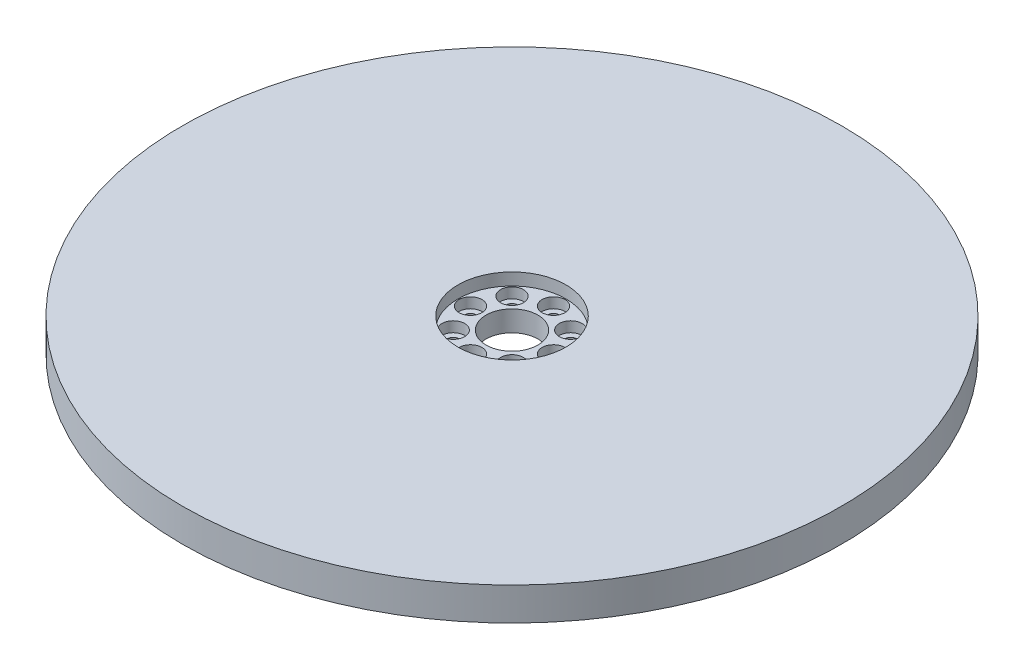
ISO-10303-21;
HEADER;
FILE_DESCRIPTION(('STEP AP214'),'2;1');
FILE_NAME('part.step','',(''),(''),'','','');
FILE_SCHEMA(('AUTOMOTIVE_DESIGN { 1 0 10303 214 1 1 1 1 }'));
ENDSEC;
DATA;
#1=APPLICATION_CONTEXT('core data for automotive mechanical design processes');
#2=APPLICATION_PROTOCOL_DEFINITION('international standard','automotive_design',2000,#1);
#3=PRODUCT_CONTEXT('',#1,'mechanical');
#4=PRODUCT('Part','Part','',(#3));
#5=PRODUCT_RELATED_PRODUCT_CATEGORY('part','',(#4));
#6=PRODUCT_DEFINITION_FORMATION('','',#4);
#7=PRODUCT_DEFINITION_CONTEXT('part definition',#1,'design');
#8=PRODUCT_DEFINITION('design','',#6,#7);
#9=PRODUCT_DEFINITION_SHAPE('','',#8);
#10=(LENGTH_UNIT() NAMED_UNIT(*) SI_UNIT(.MILLI.,.METRE.));
#11=(NAMED_UNIT(*) PLANE_ANGLE_UNIT() SI_UNIT($,.RADIAN.));
#12=(NAMED_UNIT(*) SI_UNIT($,.STERADIAN.) SOLID_ANGLE_UNIT());
#13=UNCERTAINTY_MEASURE_WITH_UNIT(LENGTH_MEASURE(1.E-05),#10,'distance_accuracy_value','');
#14=(GEOMETRIC_REPRESENTATION_CONTEXT(3) GLOBAL_UNCERTAINTY_ASSIGNED_CONTEXT((#13)) GLOBAL_UNIT_ASSIGNED_CONTEXT((#10,
#11,#12)) REPRESENTATION_CONTEXT('',''));
#15=CARTESIAN_POINT('',(0.,0.,0.));
#16=DIRECTION('',(0.,0.,1.));
#17=DIRECTION('',(1.,0.,0.));
#18=AXIS2_PLACEMENT_3D('',#15,#16,#17);
#19=CARTESIAN_POINT('',(0.,0.,0.));
#20=DIRECTION('',(0.,1.,0.));
#21=DIRECTION('',(0.,0.,1.));
#22=AXIS2_PLACEMENT_3D('',#19,#20,#21);
#23=PLANE('',#22);
#24=CARTESIAN_POINT('',(0.,0.,0.));
#25=DIRECTION('',(0.,-1.,0.));
#26=DIRECTION('',(0.,0.,-1.));
#27=AXIS2_PLACEMENT_3D('',#24,#25,#26);
#28=CIRCLE('',#27,12.9);
#29=CARTESIAN_POINT('',(0.,0.,-12.9));
#30=VERTEX_POINT('',#29);
#31=EDGE_CURVE('E11',#30,#30,#28,.T.);
#32=ORIENTED_EDGE('',*,*,#31,.F.);
#33=EDGE_LOOP('',(#32));
#34=FACE_BOUND('',#33,.T.);
#35=CARTESIAN_POINT('',(0.,0.,0.));
#36=DIRECTION('',(0.,-1.,0.));
#37=DIRECTION('',(0.,0.,-1.));
#38=AXIS2_PLACEMENT_3D('',#35,#36,#37);
#39=CIRCLE('',#38,25.4);
#40=CARTESIAN_POINT('',(0.,0.,-25.4));
#41=VERTEX_POINT('',#40);
#42=EDGE_CURVE('E155',#41,#41,#39,.T.);
#43=ORIENTED_EDGE('',*,*,#42,.T.);
#44=EDGE_LOOP('',(#43));
#45=FACE_BOUND('',#44,.T.);
#46=ADVANCED_FACE('F39',(#34,#45),#23,.F.);
#47=CARTESIAN_POINT('',(0.,-3.175,0.));
#48=DIRECTION('',(0.,1.,0.));
#49=DIRECTION('',(0.,0.,1.));
#50=AXIS2_PLACEMENT_3D('',#47,#48,#49);
#51=CYLINDRICAL_SURFACE('',#50,12.9);
#52=CARTESIAN_POINT('',(0.,-3.175,0.));
#53=DIRECTION('',(0.,-1.,0.));
#54=DIRECTION('',(0.,0.,-1.));
#55=AXIS2_PLACEMENT_3D('',#52,#53,#54);
#56=CIRCLE('',#55,12.9);
#57=CARTESIAN_POINT('',(0.,-3.175,-12.9));
#58=VERTEX_POINT('',#57);
#59=EDGE_CURVE('E52',#58,#58,#56,.T.);
#60=ORIENTED_EDGE('',*,*,#59,.F.);
#61=EDGE_LOOP('',(#60));
#62=FACE_BOUND('',#61,.T.);
#63=ORIENTED_EDGE('',*,*,#31,.T.);
#64=EDGE_LOOP('',(#63));
#65=FACE_BOUND('',#64,.T.);
#66=ADVANCED_FACE('F169',(#62,#65),#51,.T.);
#67=CARTESIAN_POINT('',(0.,-3.175,0.));
#68=DIRECTION('',(0.,-1.,0.));
#69=DIRECTION('',(0.,0.,-1.));
#70=AXIS2_PLACEMENT_3D('',#67,#68,#69);
#71=PLANE('',#70);
#72=CARTESIAN_POINT('',(-5.6568542495,-3.175,-5.6568542495));
#73=DIRECTION('',(0.,-1.,0.));
#74=DIRECTION('',(0.,0.,-1.));
#75=AXIS2_PLACEMENT_3D('',#72,#73,#74);
#76=CIRCLE('',#75,1.1);
#77=CARTESIAN_POINT('',(-5.6568542495,-3.175,-6.7568542495));
#78=VERTEX_POINT('',#77);
#79=EDGE_CURVE('E43',#78,#78,#76,.T.);
#80=ORIENTED_EDGE('',*,*,#79,.F.);
#81=EDGE_LOOP('',(#80));
#82=FACE_BOUND('',#81,.T.);
#83=CARTESIAN_POINT('',(0.,-3.175,-8.));
#84=DIRECTION('',(0.,-1.,0.));
#85=DIRECTION('',(0.,0.,-1.));
#86=AXIS2_PLACEMENT_3D('',#83,#84,#85);
#87=CIRCLE('',#86,1.1);
#88=CARTESIAN_POINT('',(0.,-3.175,-9.1));
#89=VERTEX_POINT('',#88);
#90=EDGE_CURVE('E86',#89,#89,#87,.T.);
#91=ORIENTED_EDGE('',*,*,#90,.F.);
#92=EDGE_LOOP('',(#91));
#93=FACE_BOUND('',#92,.T.);
#94=CARTESIAN_POINT('',(5.6568542495,-3.175,-5.6568542495));
#95=DIRECTION('',(0.,-1.,0.));
#96=DIRECTION('',(0.,0.,-1.));
#97=AXIS2_PLACEMENT_3D('',#94,#95,#96);
#98=CIRCLE('',#97,1.1);
#99=CARTESIAN_POINT('',(5.6568542495,-3.175,-6.7568542495));
#100=VERTEX_POINT('',#99);
#101=EDGE_CURVE('E82',#100,#100,#98,.T.);
#102=ORIENTED_EDGE('',*,*,#101,.F.);
#103=EDGE_LOOP('',(#102));
#104=FACE_BOUND('',#103,.T.);
#105=CARTESIAN_POINT('',(8.,-3.175,0.));
#106=DIRECTION('',(0.,-1.,0.));
#107=DIRECTION('',(0.,0.,-1.));
#108=AXIS2_PLACEMENT_3D('',#105,#106,#107);
#109=CIRCLE('',#108,1.1);
#110=CARTESIAN_POINT('',(8.,-3.175,-1.1));
#111=VERTEX_POINT('',#110);
#112=EDGE_CURVE('E77',#111,#111,#109,.T.);
#113=ORIENTED_EDGE('',*,*,#112,.F.);
#114=EDGE_LOOP('',(#113));
#115=FACE_BOUND('',#114,.T.);
#116=CARTESIAN_POINT('',(5.6568542495,-3.175,5.6568542495));
#117=DIRECTION('',(0.,-1.,0.));
#118=DIRECTION('',(0.,0.,-1.));
#119=AXIS2_PLACEMENT_3D('',#116,#117,#118);
#120=CIRCLE('',#119,1.1);
#121=CARTESIAN_POINT('',(5.6568542495,-3.175,4.5568542495));
#122=VERTEX_POINT('',#121);
#123=EDGE_CURVE('E72',#122,#122,#120,.T.);
#124=ORIENTED_EDGE('',*,*,#123,.F.);
#125=EDGE_LOOP('',(#124));
#126=FACE_BOUND('',#125,.T.);
#127=CARTESIAN_POINT('',(0.,-3.175,8.));
#128=DIRECTION('',(0.,-1.,0.));
#129=DIRECTION('',(0.,0.,-1.));
#130=AXIS2_PLACEMENT_3D('',#127,#128,#129);
#131=CIRCLE('',#130,1.1);
#132=CARTESIAN_POINT('',(0.,-3.175,6.9));
#133=VERTEX_POINT('',#132);
#134=EDGE_CURVE('E67',#133,#133,#131,.T.);
#135=ORIENTED_EDGE('',*,*,#134,.F.);
#136=EDGE_LOOP('',(#135));
#137=FACE_BOUND('',#136,.T.);
#138=CARTESIAN_POINT('',(-5.6568542495,-3.175,5.6568542495));
#139=DIRECTION('',(0.,-1.,0.));
#140=DIRECTION('',(0.,0.,-1.));
#141=AXIS2_PLACEMENT_3D('',#138,#139,#140);
#142=CIRCLE('',#141,1.1);
#143=CARTESIAN_POINT('',(-5.6568542495,-3.175,4.5568542495));
#144=VERTEX_POINT('',#143);
#145=EDGE_CURVE('E62',#144,#144,#142,.T.);
#146=ORIENTED_EDGE('',*,*,#145,.F.);
#147=EDGE_LOOP('',(#146));
#148=FACE_BOUND('',#147,.T.);
#149=CARTESIAN_POINT('',(-8.,-3.175,0.));
#150=DIRECTION('',(0.,-1.,0.));
#151=DIRECTION('',(0.,0.,-1.));
#152=AXIS2_PLACEMENT_3D('',#149,#150,#151);
#153=CIRCLE('',#152,1.1);
#154=CARTESIAN_POINT('',(-8.,-3.175,-1.1));
#155=VERTEX_POINT('',#154);
#156=EDGE_CURVE('E57',#155,#155,#153,.T.);
#157=ORIENTED_EDGE('',*,*,#156,.F.);
#158=EDGE_LOOP('',(#157));
#159=FACE_BOUND('',#158,.T.);
#160=CARTESIAN_POINT('',(0.,-3.175,0.));
#161=DIRECTION('',(0.,-1.,0.));
#162=DIRECTION('',(0.,0.,-1.));
#163=AXIS2_PLACEMENT_3D('',#160,#161,#162);
#164=CIRCLE('',#163,5.);
#165=CARTESIAN_POINT('',(0.,-3.175,-5.));
#166=VERTEX_POINT('',#165);
#167=EDGE_CURVE('E60',#166,#166,#164,.F.);
#168=ORIENTED_EDGE('',*,*,#167,.T.);
#169=EDGE_LOOP('',(#168));
#170=FACE_BOUND('',#169,.T.);
#171=ORIENTED_EDGE('',*,*,#59,.T.);
#172=EDGE_LOOP('',(#171));
#173=FACE_BOUND('',#172,.T.);
#174=ADVANCED_FACE('F167',(#82,#93,#104,#115,#126,#137,#148,#159,#170,#173),#71,.T.);
#175=CARTESIAN_POINT('',(0.,-3.175,0.));
#176=DIRECTION('',(0.,-1.,0.));
#177=DIRECTION('',(0.,0.,-1.));
#178=AXIS2_PLACEMENT_3D('',#175,#176,#177);
#179=PLANE('',#178);
#180=CARTESIAN_POINT('',(0.,-3.175,0.));
#181=DIRECTION('',(0.,-1.,0.));
#182=DIRECTION('',(0.,0.,-1.));
#183=AXIS2_PLACEMENT_3D('',#180,#181,#182);
#184=CIRCLE('',#183,63.5);
#185=CARTESIAN_POINT('',(0.,-3.175,-63.5));
#186=VERTEX_POINT('',#185);
#187=EDGE_CURVE('E159',#186,#186,#184,.T.);
#188=ORIENTED_EDGE('',*,*,#187,.T.);
#189=EDGE_LOOP('',(#188));
#190=FACE_BOUND('',#189,.T.);
#191=CARTESIAN_POINT('',(0.,-3.175,0.));
#192=DIRECTION('',(0.,-1.,0.));
#193=DIRECTION('',(0.,0.,-1.));
#194=AXIS2_PLACEMENT_3D('',#191,#192,#193);
#195=CIRCLE('',#194,25.4);
#196=CARTESIAN_POINT('',(0.,-3.175,-25.4));
#197=VERTEX_POINT('',#196);
#198=EDGE_CURVE('E156',#197,#197,#195,.T.);
#199=ORIENTED_EDGE('',*,*,#198,.F.);
#200=EDGE_LOOP('',(#199));
#201=FACE_BOUND('',#200,.T.);
#202=ADVANCED_FACE('F176',(#190,#201),#179,.T.);
#203=CARTESIAN_POINT('',(0.,-3.175,0.));
#204=DIRECTION('',(0.,1.,0.));
#205=DIRECTION('',(0.,0.,1.));
#206=AXIS2_PLACEMENT_3D('',#203,#204,#205);
#207=CYLINDRICAL_SURFACE('',#206,25.4);
#208=ORIENTED_EDGE('',*,*,#198,.T.);
#209=EDGE_LOOP('',(#208));
#210=FACE_BOUND('',#209,.T.);
#211=ORIENTED_EDGE('',*,*,#42,.F.);
#212=EDGE_LOOP('',(#211));
#213=FACE_BOUND('',#212,.T.);
#214=ADVANCED_FACE('F184',(#210,#213),#207,.F.);
#215=CARTESIAN_POINT('',(0.,3.175,0.));
#216=DIRECTION('',(0.,1.,0.));
#217=DIRECTION('',(0.,0.,1.));
#218=AXIS2_PLACEMENT_3D('',#215,#216,#217);
#219=PLANE('',#218);
#220=CARTESIAN_POINT('',(0.,3.175,0.));
#221=DIRECTION('',(0.,1.,0.));
#222=DIRECTION('',(0.,0.,1.));
#223=AXIS2_PLACEMENT_3D('',#220,#221,#222);
#224=CIRCLE('',#223,10.4);
#225=CARTESIAN_POINT('',(0.,3.175,10.4));
#226=VERTEX_POINT('',#225);
#227=EDGE_CURVE('E147',#226,#226,#224,.T.);
#228=ORIENTED_EDGE('',*,*,#227,.F.);
#229=EDGE_LOOP('',(#228));
#230=FACE_BOUND('',#229,.T.);
#231=CARTESIAN_POINT('',(0.,3.175,0.));
#232=DIRECTION('',(0.,1.,0.));
#233=DIRECTION('',(0.,0.,1.));
#234=AXIS2_PLACEMENT_3D('',#231,#232,#233);
#235=CIRCLE('',#234,63.5);
#236=CARTESIAN_POINT('',(0.,3.175,63.5));
#237=VERTEX_POINT('',#236);
#238=EDGE_CURVE('E47',#237,#237,#235,.T.);
#239=ORIENTED_EDGE('',*,*,#238,.T.);
#240=EDGE_LOOP('',(#239));
#241=FACE_BOUND('',#240,.T.);
#242=ADVANCED_FACE('F182',(#230,#241),#219,.T.);
#243=CARTESIAN_POINT('',(0.,3.175,0.));
#244=DIRECTION('',(0.,-1.,0.));
#245=DIRECTION('',(0.,0.,-1.));
#246=AXIS2_PLACEMENT_3D('',#243,#244,#245);
#247=CYLINDRICAL_SURFACE('',#246,63.5);
#248=ORIENTED_EDGE('',*,*,#238,.F.);
#249=EDGE_LOOP('',(#248));
#250=FACE_BOUND('',#249,.T.);
#251=ORIENTED_EDGE('',*,*,#187,.F.);
#252=EDGE_LOOP('',(#251));
#253=FACE_BOUND('',#252,.T.);
#254=ADVANCED_FACE('F41',(#250,#253),#247,.T.);
#255=CARTESIAN_POINT('',(0.,0.825,0.));
#256=DIRECTION('',(0.,-1.,0.));
#257=DIRECTION('',(0.,0.,-1.));
#258=AXIS2_PLACEMENT_3D('',#255,#256,#257);
#259=PLANE('',#258);
#260=CARTESIAN_POINT('',(-5.6568542495,0.825,-5.6568542495));
#261=DIRECTION('',(0.,1.,0.));
#262=DIRECTION('',(0.,0.,1.));
#263=AXIS2_PLACEMENT_3D('',#260,#261,#262);
#264=CIRCLE('',#263,2.19999999999999);
#265=CARTESIAN_POINT('',(-5.6568542495,0.825,-3.45685424950001));
#266=VERTEX_POINT('',#265);
#267=EDGE_CURVE('E591',#266,#266,#264,.T.);
#268=ORIENTED_EDGE('',*,*,#267,.F.);
#269=EDGE_LOOP('',(#268));
#270=FACE_BOUND('',#269,.T.);
#271=CARTESIAN_POINT('',(0.,0.825,-8.));
#272=DIRECTION('',(0.,1.,0.));
#273=DIRECTION('',(0.,0.,1.));
#274=AXIS2_PLACEMENT_3D('',#271,#272,#273);
#275=CIRCLE('',#274,2.19999999999999);
#276=CARTESIAN_POINT('',(0.,0.825,-5.80000000000001));
#277=VERTEX_POINT('',#276);
#278=EDGE_CURVE('E101',#277,#277,#275,.T.);
#279=ORIENTED_EDGE('',*,*,#278,.F.);
#280=EDGE_LOOP('',(#279));
#281=FACE_BOUND('',#280,.T.);
#282=CARTESIAN_POINT('',(5.6568542495,0.825,-5.6568542495));
#283=DIRECTION('',(0.,1.,0.));
#284=DIRECTION('',(0.,0.,1.));
#285=AXIS2_PLACEMENT_3D('',#282,#283,#284);
#286=CIRCLE('',#285,2.19999999999999);
#287=CARTESIAN_POINT('',(5.6568542495,0.825,-3.45685424950001));
#288=VERTEX_POINT('',#287);
#289=EDGE_CURVE('E88',#288,#288,#286,.T.);
#290=ORIENTED_EDGE('',*,*,#289,.F.);
#291=EDGE_LOOP('',(#290));
#292=FACE_BOUND('',#291,.T.);
#293=CARTESIAN_POINT('',(8.,0.825,0.));
#294=DIRECTION('',(0.,1.,0.));
#295=DIRECTION('',(0.,0.,1.));
#296=AXIS2_PLACEMENT_3D('',#293,#294,#295);
#297=CIRCLE('',#296,2.19999999999999);
#298=CARTESIAN_POINT('',(8.,0.825,2.19999999999999));
#299=VERTEX_POINT('',#298);
#300=EDGE_CURVE('E84',#299,#299,#297,.T.);
#301=ORIENTED_EDGE('',*,*,#300,.F.);
#302=EDGE_LOOP('',(#301));
#303=FACE_BOUND('',#302,.T.);
#304=CARTESIAN_POINT('',(5.6568542495,0.825,5.6568542495));
#305=DIRECTION('',(0.,1.,0.));
#306=DIRECTION('',(0.,0.,1.));
#307=AXIS2_PLACEMENT_3D('',#304,#305,#306);
#308=CIRCLE('',#307,2.19999999999999);
#309=CARTESIAN_POINT('',(5.6568542495,0.825,7.85685424949999));
#310=VERTEX_POINT('',#309);
#311=EDGE_CURVE('E80',#310,#310,#308,.T.);
#312=ORIENTED_EDGE('',*,*,#311,.F.);
#313=EDGE_LOOP('',(#312));
#314=FACE_BOUND('',#313,.T.);
#315=CARTESIAN_POINT('',(0.,0.825,8.));
#316=DIRECTION('',(0.,1.,0.));
#317=DIRECTION('',(0.,0.,1.));
#318=AXIS2_PLACEMENT_3D('',#315,#316,#317);
#319=CIRCLE('',#318,2.19999999999999);
#320=CARTESIAN_POINT('',(0.,0.825,10.2));
#321=VERTEX_POINT('',#320);
#322=EDGE_CURVE('E75',#321,#321,#319,.T.);
#323=ORIENTED_EDGE('',*,*,#322,.F.);
#324=EDGE_LOOP('',(#323));
#325=FACE_BOUND('',#324,.T.);
#326=CARTESIAN_POINT('',(-5.6568542495,0.825,5.6568542495));
#327=DIRECTION('',(0.,1.,0.));
#328=DIRECTION('',(0.,0.,1.));
#329=AXIS2_PLACEMENT_3D('',#326,#327,#328);
#330=CIRCLE('',#329,2.19999999999999);
#331=CARTESIAN_POINT('',(-5.6568542495,0.825,7.85685424949999));
#332=VERTEX_POINT('',#331);
#333=EDGE_CURVE('E70',#332,#332,#330,.T.);
#334=ORIENTED_EDGE('',*,*,#333,.F.);
#335=EDGE_LOOP('',(#334));
#336=FACE_BOUND('',#335,.T.);
#337=CARTESIAN_POINT('',(-8.,0.825,0.));
#338=DIRECTION('',(0.,1.,0.));
#339=DIRECTION('',(0.,0.,1.));
#340=AXIS2_PLACEMENT_3D('',#337,#338,#339);
#341=CIRCLE('',#340,2.19999999999999);
#342=CARTESIAN_POINT('',(-8.,0.825,2.19999999999999));
#343=VERTEX_POINT('',#342);
#344=EDGE_CURVE('E65',#343,#343,#341,.T.);
#345=ORIENTED_EDGE('',*,*,#344,.F.);
#346=EDGE_LOOP('',(#345));
#347=FACE_BOUND('',#346,.T.);
#348=CARTESIAN_POINT('',(0.,0.825,0.));
#349=DIRECTION('',(0.,1.,0.));
#350=DIRECTION('',(0.,0.,1.));
#351=AXIS2_PLACEMENT_3D('',#348,#349,#350);
#352=CIRCLE('',#351,5.);
#353=CARTESIAN_POINT('',(0.,0.825,5.));
#354=VERTEX_POINT('',#353);
#355=EDGE_CURVE('E144',#354,#354,#352,.T.);
#356=ORIENTED_EDGE('',*,*,#355,.F.);
#357=EDGE_LOOP('',(#356));
#358=FACE_BOUND('',#357,.T.);
#359=CARTESIAN_POINT('',(0.,0.824999999999999,0.));
#360=DIRECTION('',(0.,-1.,0.));
#361=DIRECTION('',(0.,0.,-1.));
#362=AXIS2_PLACEMENT_3D('',#359,#360,#361);
#363=CIRCLE('',#362,10.4);
#364=CARTESIAN_POINT('',(0.,0.824999999999999,-10.4));
#365=VERTEX_POINT('',#364);
#366=EDGE_CURVE('E152',#365,#365,#363,.F.);
#367=ORIENTED_EDGE('',*,*,#366,.T.);
#368=EDGE_LOOP('',(#367));
#369=FACE_BOUND('',#368,.T.);
#370=ADVANCED_FACE('F190',(#270,#281,#292,#303,#314,#325,#336,#347,#358,#369),#259,.F.);
#371=CARTESIAN_POINT('',(0.,-32.5906420973604,0.));
#372=DIRECTION('',(0.,1.,0.));
#373=DIRECTION('',(0.,0.,1.));
#374=AXIS2_PLACEMENT_3D('',#371,#372,#373);
#375=CYLINDRICAL_SURFACE('',#374,10.4);
#376=ORIENTED_EDGE('',*,*,#227,.T.);
#377=EDGE_LOOP('',(#376));
#378=FACE_BOUND('',#377,.T.);
#379=ORIENTED_EDGE('',*,*,#366,.F.);
#380=EDGE_LOOP('',(#379));
#381=FACE_BOUND('',#380,.T.);
#382=ADVANCED_FACE('F199',(#378,#381),#375,.F.);
#383=CARTESIAN_POINT('',(0.,-3.176,0.));
#384=DIRECTION('',(0.,1.,0.));
#385=DIRECTION('',(0.,0.,1.));
#386=AXIS2_PLACEMENT_3D('',#383,#384,#385);
#387=CYLINDRICAL_SURFACE('',#386,5.);
#388=ORIENTED_EDGE('',*,*,#167,.F.);
#389=EDGE_LOOP('',(#388));
#390=FACE_BOUND('',#389,.T.);
#391=ORIENTED_EDGE('',*,*,#355,.T.);
#392=EDGE_LOOP('',(#391));
#393=FACE_BOUND('',#392,.T.);
#394=ADVANCED_FACE('F202',(#390,#393),#387,.F.);
#395=CARTESIAN_POINT('',(-8.,0.825,0.));
#396=DIRECTION('',(0.,1.,0.));
#397=DIRECTION('',(0.,0.,1.));
#398=AXIS2_PLACEMENT_3D('',#395,#396,#397);
#399=CYLINDRICAL_SURFACE('',#398,1.1);
#400=ORIENTED_EDGE('',*,*,#156,.T.);
#401=EDGE_LOOP('',(#400));
#402=FACE_BOUND('',#401,.T.);
#403=CARTESIAN_POINT('',(-8.,-1.175,0.));
#404=DIRECTION('',(0.,1.,0.));
#405=DIRECTION('',(0.,0.,1.));
#406=AXIS2_PLACEMENT_3D('',#403,#404,#405);
#407=CIRCLE('',#406,1.1);
#408=CARTESIAN_POINT('',(-8.,-1.175,1.1));
#409=VERTEX_POINT('',#408);
#410=EDGE_CURVE('E61',#409,#409,#407,.T.);
#411=ORIENTED_EDGE('',*,*,#410,.T.);
#412=EDGE_LOOP('',(#411));
#413=FACE_BOUND('',#412,.T.);
#414=ADVANCED_FACE('F259',(#402,#413),#399,.F.);
#415=CARTESIAN_POINT('',(-6.9,-1.175,0.));
#416=DIRECTION('',(0.,-1.,0.));
#417=DIRECTION('',(0.,0.,-1.));
#418=AXIS2_PLACEMENT_3D('',#415,#416,#417);
#419=PLANE('',#418);
#420=ORIENTED_EDGE('',*,*,#410,.F.);
#421=EDGE_LOOP('',(#420));
#422=FACE_BOUND('',#421,.T.);
#423=CARTESIAN_POINT('',(-8.,-1.175,0.));
#424=DIRECTION('',(0.,1.,0.));
#425=DIRECTION('',(0.,0.,1.));
#426=AXIS2_PLACEMENT_3D('',#423,#424,#425);
#427=CIRCLE('',#426,2.2);
#428=CARTESIAN_POINT('',(-8.,-1.175,2.2));
#429=VERTEX_POINT('',#428);
#430=EDGE_CURVE('E139',#429,#429,#427,.T.);
#431=ORIENTED_EDGE('',*,*,#430,.T.);
#432=EDGE_LOOP('',(#431));
#433=FACE_BOUND('',#432,.T.);
#434=ADVANCED_FACE('F280',(#422,#433),#419,.F.);
#435=CARTESIAN_POINT('',(-8.,0.825,0.));
#436=DIRECTION('',(0.,1.,0.));
#437=DIRECTION('',(0.,0.,1.));
#438=AXIS2_PLACEMENT_3D('',#435,#436,#437);
#439=CYLINDRICAL_SURFACE('',#438,2.19999999999999);
#440=ORIENTED_EDGE('',*,*,#430,.F.);
#441=EDGE_LOOP('',(#440));
#442=FACE_BOUND('',#441,.T.);
#443=ORIENTED_EDGE('',*,*,#344,.T.);
#444=EDGE_LOOP('',(#443));
#445=FACE_BOUND('',#444,.T.);
#446=ADVANCED_FACE('F291',(#442,#445),#439,.F.);
#447=CARTESIAN_POINT('',(-5.6568542495,0.825,5.6568542495));
#448=DIRECTION('',(0.,1.,0.));
#449=DIRECTION('',(0.,0.,1.));
#450=AXIS2_PLACEMENT_3D('',#447,#448,#449);
#451=CYLINDRICAL_SURFACE('',#450,1.1);
#452=ORIENTED_EDGE('',*,*,#145,.T.);
#453=EDGE_LOOP('',(#452));
#454=FACE_BOUND('',#453,.T.);
#455=CARTESIAN_POINT('',(-5.6568542495,-1.175,5.6568542495));
#456=DIRECTION('',(0.,1.,0.));
#457=DIRECTION('',(0.,0.,1.));
#458=AXIS2_PLACEMENT_3D('',#455,#456,#457);
#459=CIRCLE('',#458,1.1);
#460=CARTESIAN_POINT('',(-5.6568542495,-1.175,6.7568542495));
#461=VERTEX_POINT('',#460);
#462=EDGE_CURVE('E66',#461,#461,#459,.T.);
#463=ORIENTED_EDGE('',*,*,#462,.T.);
#464=EDGE_LOOP('',(#463));
#465=FACE_BOUND('',#464,.T.);
#466=ADVANCED_FACE('F302',(#454,#465),#451,.F.);
#467=CARTESIAN_POINT('',(-4.5568542495,-1.175,5.6568542495));
#468=DIRECTION('',(0.,-1.,0.));
#469=DIRECTION('',(0.,0.,-1.));
#470=AXIS2_PLACEMENT_3D('',#467,#468,#469);
#471=PLANE('',#470);
#472=ORIENTED_EDGE('',*,*,#462,.F.);
#473=EDGE_LOOP('',(#472));
#474=FACE_BOUND('',#473,.T.);
#475=CARTESIAN_POINT('',(-5.6568542495,-1.175,5.6568542495));
#476=DIRECTION('',(0.,1.,0.));
#477=DIRECTION('',(0.,0.,1.));
#478=AXIS2_PLACEMENT_3D('',#475,#476,#477);
#479=CIRCLE('',#478,2.2);
#480=CARTESIAN_POINT('',(-5.6568542495,-1.175,7.8568542495));
#481=VERTEX_POINT('',#480);
#482=EDGE_CURVE('E132',#481,#481,#479,.T.);
#483=ORIENTED_EDGE('',*,*,#482,.T.);
#484=EDGE_LOOP('',(#483));
#485=FACE_BOUND('',#484,.T.);
#486=ADVANCED_FACE('F313',(#474,#485),#471,.F.);
#487=CARTESIAN_POINT('',(-5.6568542495,0.825,5.6568542495));
#488=DIRECTION('',(0.,1.,0.));
#489=DIRECTION('',(0.,0.,1.));
#490=AXIS2_PLACEMENT_3D('',#487,#488,#489);
#491=CYLINDRICAL_SURFACE('',#490,2.19999999999999);
#492=ORIENTED_EDGE('',*,*,#482,.F.);
#493=EDGE_LOOP('',(#492));
#494=FACE_BOUND('',#493,.T.);
#495=ORIENTED_EDGE('',*,*,#333,.T.);
#496=EDGE_LOOP('',(#495));
#497=FACE_BOUND('',#496,.T.);
#498=ADVANCED_FACE('F324',(#494,#497),#491,.F.);
#499=CARTESIAN_POINT('',(0.,0.825,8.));
#500=DIRECTION('',(0.,1.,0.));
#501=DIRECTION('',(0.,0.,1.));
#502=AXIS2_PLACEMENT_3D('',#499,#500,#501);
#503=CYLINDRICAL_SURFACE('',#502,1.1);
#504=ORIENTED_EDGE('',*,*,#134,.T.);
#505=EDGE_LOOP('',(#504));
#506=FACE_BOUND('',#505,.T.);
#507=CARTESIAN_POINT('',(0.,-1.175,8.));
#508=DIRECTION('',(0.,1.,0.));
#509=DIRECTION('',(0.,0.,1.));
#510=AXIS2_PLACEMENT_3D('',#507,#508,#509);
#511=CIRCLE('',#510,1.1);
#512=CARTESIAN_POINT('',(0.,-1.175,9.1));
#513=VERTEX_POINT('',#512);
#514=EDGE_CURVE('E71',#513,#513,#511,.T.);
#515=ORIENTED_EDGE('',*,*,#514,.T.);
#516=EDGE_LOOP('',(#515));
#517=FACE_BOUND('',#516,.T.);
#518=ADVANCED_FACE('F335',(#506,#517),#503,.F.);
#519=CARTESIAN_POINT('',(1.1,-1.175,8.));
#520=DIRECTION('',(0.,-1.,0.));
#521=DIRECTION('',(0.,0.,-1.));
#522=AXIS2_PLACEMENT_3D('',#519,#520,#521);
#523=PLANE('',#522);
#524=ORIENTED_EDGE('',*,*,#514,.F.);
#525=EDGE_LOOP('',(#524));
#526=FACE_BOUND('',#525,.T.);
#527=CARTESIAN_POINT('',(0.,-1.175,8.));
#528=DIRECTION('',(0.,1.,0.));
#529=DIRECTION('',(0.,0.,1.));
#530=AXIS2_PLACEMENT_3D('',#527,#528,#529);
#531=CIRCLE('',#530,2.2);
#532=CARTESIAN_POINT('',(0.,-1.175,10.2));
#533=VERTEX_POINT('',#532);
#534=EDGE_CURVE('E125',#533,#533,#531,.T.);
#535=ORIENTED_EDGE('',*,*,#534,.T.);
#536=EDGE_LOOP('',(#535));
#537=FACE_BOUND('',#536,.T.);
#538=ADVANCED_FACE('F346',(#526,#537),#523,.F.);
#539=CARTESIAN_POINT('',(0.,0.825,8.));
#540=DIRECTION('',(0.,1.,0.));
#541=DIRECTION('',(0.,0.,1.));
#542=AXIS2_PLACEMENT_3D('',#539,#540,#541);
#543=CYLINDRICAL_SURFACE('',#542,2.19999999999999);
#544=ORIENTED_EDGE('',*,*,#534,.F.);
#545=EDGE_LOOP('',(#544));
#546=FACE_BOUND('',#545,.T.);
#547=ORIENTED_EDGE('',*,*,#322,.T.);
#548=EDGE_LOOP('',(#547));
#549=FACE_BOUND('',#548,.T.);
#550=ADVANCED_FACE('F357',(#546,#549),#543,.F.);
#551=CARTESIAN_POINT('',(5.6568542495,0.825,5.6568542495));
#552=DIRECTION('',(0.,1.,0.));
#553=DIRECTION('',(0.,0.,1.));
#554=AXIS2_PLACEMENT_3D('',#551,#552,#553);
#555=CYLINDRICAL_SURFACE('',#554,1.1);
#556=ORIENTED_EDGE('',*,*,#123,.T.);
#557=EDGE_LOOP('',(#556));
#558=FACE_BOUND('',#557,.T.);
#559=CARTESIAN_POINT('',(5.6568542495,-1.175,5.6568542495));
#560=DIRECTION('',(0.,1.,0.));
#561=DIRECTION('',(0.,0.,1.));
#562=AXIS2_PLACEMENT_3D('',#559,#560,#561);
#563=CIRCLE('',#562,1.1);
#564=CARTESIAN_POINT('',(5.6568542495,-1.175,6.7568542495));
#565=VERTEX_POINT('',#564);
#566=EDGE_CURVE('E76',#565,#565,#563,.T.);
#567=ORIENTED_EDGE('',*,*,#566,.T.);
#568=EDGE_LOOP('',(#567));
#569=FACE_BOUND('',#568,.T.);
#570=ADVANCED_FACE('F368',(#558,#569),#555,.F.);
#571=CARTESIAN_POINT('',(6.7568542495,-1.175,5.6568542495));
#572=DIRECTION('',(0.,-1.,0.));
#573=DIRECTION('',(0.,0.,-1.));
#574=AXIS2_PLACEMENT_3D('',#571,#572,#573);
#575=PLANE('',#574);
#576=ORIENTED_EDGE('',*,*,#566,.F.);
#577=EDGE_LOOP('',(#576));
#578=FACE_BOUND('',#577,.T.);
#579=CARTESIAN_POINT('',(5.6568542495,-1.175,5.6568542495));
#580=DIRECTION('',(0.,1.,0.));
#581=DIRECTION('',(0.,0.,1.));
#582=AXIS2_PLACEMENT_3D('',#579,#580,#581);
#583=CIRCLE('',#582,2.2);
#584=CARTESIAN_POINT('',(5.6568542495,-1.175,7.8568542495));
#585=VERTEX_POINT('',#584);
#586=EDGE_CURVE('E118',#585,#585,#583,.T.);
#587=ORIENTED_EDGE('',*,*,#586,.T.);
#588=EDGE_LOOP('',(#587));
#589=FACE_BOUND('',#588,.T.);
#590=ADVANCED_FACE('F379',(#578,#589),#575,.F.);
#591=CARTESIAN_POINT('',(5.6568542495,0.825,5.6568542495));
#592=DIRECTION('',(0.,1.,0.));
#593=DIRECTION('',(0.,0.,1.));
#594=AXIS2_PLACEMENT_3D('',#591,#592,#593);
#595=CYLINDRICAL_SURFACE('',#594,2.19999999999999);
#596=ORIENTED_EDGE('',*,*,#586,.F.);
#597=EDGE_LOOP('',(#596));
#598=FACE_BOUND('',#597,.T.);
#599=ORIENTED_EDGE('',*,*,#311,.T.);
#600=EDGE_LOOP('',(#599));
#601=FACE_BOUND('',#600,.T.);
#602=ADVANCED_FACE('F390',(#598,#601),#595,.F.);
#603=CARTESIAN_POINT('',(8.,0.825,0.));
#604=DIRECTION('',(0.,1.,0.));
#605=DIRECTION('',(0.,0.,1.));
#606=AXIS2_PLACEMENT_3D('',#603,#604,#605);
#607=CYLINDRICAL_SURFACE('',#606,1.1);
#608=ORIENTED_EDGE('',*,*,#112,.T.);
#609=EDGE_LOOP('',(#608));
#610=FACE_BOUND('',#609,.T.);
#611=CARTESIAN_POINT('',(8.,-1.175,0.));
#612=DIRECTION('',(0.,1.,0.));
#613=DIRECTION('',(0.,0.,1.));
#614=AXIS2_PLACEMENT_3D('',#611,#612,#613);
#615=CIRCLE('',#614,1.1);
#616=CARTESIAN_POINT('',(8.,-1.175,1.1));
#617=VERTEX_POINT('',#616);
#618=EDGE_CURVE('E81',#617,#617,#615,.T.);
#619=ORIENTED_EDGE('',*,*,#618,.T.);
#620=EDGE_LOOP('',(#619));
#621=FACE_BOUND('',#620,.T.);
#622=ADVANCED_FACE('F401',(#610,#621),#607,.F.);
#623=CARTESIAN_POINT('',(9.1,-1.175,0.));
#624=DIRECTION('',(0.,-1.,0.));
#625=DIRECTION('',(0.,0.,-1.));
#626=AXIS2_PLACEMENT_3D('',#623,#624,#625);
#627=PLANE('',#626);
#628=ORIENTED_EDGE('',*,*,#618,.F.);
#629=EDGE_LOOP('',(#628));
#630=FACE_BOUND('',#629,.T.);
#631=CARTESIAN_POINT('',(8.,-1.175,0.));
#632=DIRECTION('',(0.,1.,0.));
#633=DIRECTION('',(0.,0.,1.));
#634=AXIS2_PLACEMENT_3D('',#631,#632,#633);
#635=CIRCLE('',#634,2.2);
#636=CARTESIAN_POINT('',(8.,-1.175,2.2));
#637=VERTEX_POINT('',#636);
#638=EDGE_CURVE('E111',#637,#637,#635,.T.);
#639=ORIENTED_EDGE('',*,*,#638,.T.);
#640=EDGE_LOOP('',(#639));
#641=FACE_BOUND('',#640,.T.);
#642=ADVANCED_FACE('F412',(#630,#641),#627,.F.);
#643=CARTESIAN_POINT('',(8.,0.825,0.));
#644=DIRECTION('',(0.,1.,0.));
#645=DIRECTION('',(0.,0.,1.));
#646=AXIS2_PLACEMENT_3D('',#643,#644,#645);
#647=CYLINDRICAL_SURFACE('',#646,2.2);
#648=ORIENTED_EDGE('',*,*,#638,.F.);
#649=EDGE_LOOP('',(#648));
#650=FACE_BOUND('',#649,.T.);
#651=ORIENTED_EDGE('',*,*,#300,.T.);
#652=EDGE_LOOP('',(#651));
#653=FACE_BOUND('',#652,.T.);
#654=ADVANCED_FACE('F423',(#650,#653),#647,.F.);
#655=CARTESIAN_POINT('',(5.6568542495,0.825,-5.6568542495));
#656=DIRECTION('',(0.,1.,0.));
#657=DIRECTION('',(0.,0.,1.));
#658=AXIS2_PLACEMENT_3D('',#655,#656,#657);
#659=CYLINDRICAL_SURFACE('',#658,1.1);
#660=ORIENTED_EDGE('',*,*,#101,.T.);
#661=EDGE_LOOP('',(#660));
#662=FACE_BOUND('',#661,.T.);
#663=CARTESIAN_POINT('',(5.6568542495,-1.175,-5.6568542495));
#664=DIRECTION('',(0.,1.,0.));
#665=DIRECTION('',(0.,0.,1.));
#666=AXIS2_PLACEMENT_3D('',#663,#664,#665);
#667=CIRCLE('',#666,1.1);
#668=CARTESIAN_POINT('',(5.6568542495,-1.175,-4.5568542495));
#669=VERTEX_POINT('',#668);
#670=EDGE_CURVE('E85',#669,#669,#667,.T.);
#671=ORIENTED_EDGE('',*,*,#670,.T.);
#672=EDGE_LOOP('',(#671));
#673=FACE_BOUND('',#672,.T.);
#674=ADVANCED_FACE('F434',(#662,#673),#659,.F.);
#675=CARTESIAN_POINT('',(6.7568542495,-1.175,-5.6568542495));
#676=DIRECTION('',(0.,-1.,0.));
#677=DIRECTION('',(0.,0.,-1.));
#678=AXIS2_PLACEMENT_3D('',#675,#676,#677);
#679=PLANE('',#678);
#680=ORIENTED_EDGE('',*,*,#670,.F.);
#681=EDGE_LOOP('',(#680));
#682=FACE_BOUND('',#681,.T.);
#683=CARTESIAN_POINT('',(5.6568542495,-1.175,-5.6568542495));
#684=DIRECTION('',(0.,1.,0.));
#685=DIRECTION('',(0.,0.,1.));
#686=AXIS2_PLACEMENT_3D('',#683,#684,#685);
#687=CIRCLE('',#686,2.2);
#688=CARTESIAN_POINT('',(5.6568542495,-1.175,-3.4568542495));
#689=VERTEX_POINT('',#688);
#690=EDGE_CURVE('E93',#689,#689,#687,.T.);
#691=ORIENTED_EDGE('',*,*,#690,.T.);
#692=EDGE_LOOP('',(#691));
#693=FACE_BOUND('',#692,.T.);
#694=ADVANCED_FACE('F445',(#682,#693),#679,.F.);
#695=CARTESIAN_POINT('',(5.6568542495,0.825,-5.6568542495));
#696=DIRECTION('',(0.,1.,0.));
#697=DIRECTION('',(0.,0.,1.));
#698=AXIS2_PLACEMENT_3D('',#695,#696,#697);
#699=CYLINDRICAL_SURFACE('',#698,2.19999999999999);
#700=ORIENTED_EDGE('',*,*,#690,.F.);
#701=EDGE_LOOP('',(#700));
#702=FACE_BOUND('',#701,.T.);
#703=ORIENTED_EDGE('',*,*,#289,.T.);
#704=EDGE_LOOP('',(#703));
#705=FACE_BOUND('',#704,.T.);
#706=ADVANCED_FACE('F456',(#702,#705),#699,.F.);
#707=CARTESIAN_POINT('',(0.,0.825,-8.));
#708=DIRECTION('',(0.,1.,0.));
#709=DIRECTION('',(0.,0.,1.));
#710=AXIS2_PLACEMENT_3D('',#707,#708,#709);
#711=CYLINDRICAL_SURFACE('',#710,1.1);
#712=ORIENTED_EDGE('',*,*,#90,.T.);
#713=EDGE_LOOP('',(#712));
#714=FACE_BOUND('',#713,.T.);
#715=CARTESIAN_POINT('',(0.,-1.175,-8.));
#716=DIRECTION('',(0.,1.,0.));
#717=DIRECTION('',(0.,0.,1.));
#718=AXIS2_PLACEMENT_3D('',#715,#716,#717);
#719=CIRCLE('',#718,1.1);
#720=CARTESIAN_POINT('',(0.,-1.175,-6.9));
#721=VERTEX_POINT('',#720);
#722=EDGE_CURVE('E89',#721,#721,#719,.T.);
#723=ORIENTED_EDGE('',*,*,#722,.T.);
#724=EDGE_LOOP('',(#723));
#725=FACE_BOUND('',#724,.T.);
#726=ADVANCED_FACE('F467',(#714,#725),#711,.F.);
#727=CARTESIAN_POINT('',(1.1,-1.175,-8.));
#728=DIRECTION('',(0.,-1.,0.));
#729=DIRECTION('',(0.,0.,-1.));
#730=AXIS2_PLACEMENT_3D('',#727,#728,#729);
#731=PLANE('',#730);
#732=ORIENTED_EDGE('',*,*,#722,.F.);
#733=EDGE_LOOP('',(#732));
#734=FACE_BOUND('',#733,.T.);
#735=CARTESIAN_POINT('',(0.,-1.175,-8.));
#736=DIRECTION('',(0.,1.,0.));
#737=DIRECTION('',(0.,0.,1.));
#738=AXIS2_PLACEMENT_3D('',#735,#736,#737);
#739=CIRCLE('',#738,2.2);
#740=CARTESIAN_POINT('',(0.,-1.175,-5.8));
#741=VERTEX_POINT('',#740);
#742=EDGE_CURVE('E96',#741,#741,#739,.T.);
#743=ORIENTED_EDGE('',*,*,#742,.T.);
#744=EDGE_LOOP('',(#743));
#745=FACE_BOUND('',#744,.T.);
#746=ADVANCED_FACE('F478',(#734,#745),#731,.F.);
#747=CARTESIAN_POINT('',(0.,0.825,-8.));
#748=DIRECTION('',(0.,1.,0.));
#749=DIRECTION('',(0.,0.,1.));
#750=AXIS2_PLACEMENT_3D('',#747,#748,#749);
#751=CYLINDRICAL_SURFACE('',#750,2.19999999999999);
#752=ORIENTED_EDGE('',*,*,#742,.F.);
#753=EDGE_LOOP('',(#752));
#754=FACE_BOUND('',#753,.T.);
#755=ORIENTED_EDGE('',*,*,#278,.T.);
#756=EDGE_LOOP('',(#755));
#757=FACE_BOUND('',#756,.T.);
#758=ADVANCED_FACE('F488',(#754,#757),#751,.F.);
#759=CARTESIAN_POINT('',(-5.6568542495,0.825,-5.6568542495));
#760=DIRECTION('',(0.,1.,0.));
#761=DIRECTION('',(0.,0.,1.));
#762=AXIS2_PLACEMENT_3D('',#759,#760,#761);
#763=CYLINDRICAL_SURFACE('',#762,1.1);
#764=ORIENTED_EDGE('',*,*,#79,.T.);
#765=EDGE_LOOP('',(#764));
#766=FACE_BOUND('',#765,.T.);
#767=CARTESIAN_POINT('',(-5.6568542495,-1.175,-5.6568542495));
#768=DIRECTION('',(0.,1.,0.));
#769=DIRECTION('',(0.,0.,1.));
#770=AXIS2_PLACEMENT_3D('',#767,#768,#769);
#771=CIRCLE('',#770,1.1);
#772=CARTESIAN_POINT('',(-5.6568542495,-1.175,-4.5568542495));
#773=VERTEX_POINT('',#772);
#774=EDGE_CURVE('E593',#773,#773,#771,.T.);
#775=ORIENTED_EDGE('',*,*,#774,.T.);
#776=EDGE_LOOP('',(#775));
#777=FACE_BOUND('',#776,.T.);
#778=ADVANCED_FACE('F499',(#766,#777),#763,.F.);
#779=CARTESIAN_POINT('',(-4.5568542495,-1.175,-5.6568542495));
#780=DIRECTION('',(0.,-1.,0.));
#781=DIRECTION('',(0.,0.,-1.));
#782=AXIS2_PLACEMENT_3D('',#779,#780,#781);
#783=PLANE('',#782);
#784=ORIENTED_EDGE('',*,*,#774,.F.);
#785=EDGE_LOOP('',(#784));
#786=FACE_BOUND('',#785,.T.);
#787=CARTESIAN_POINT('',(-5.6568542495,-1.175,-5.6568542495));
#788=DIRECTION('',(0.,1.,0.));
#789=DIRECTION('',(0.,0.,1.));
#790=AXIS2_PLACEMENT_3D('',#787,#788,#789);
#791=CIRCLE('',#790,2.2);
#792=CARTESIAN_POINT('',(-5.6568542495,-1.175,-3.4568542495));
#793=VERTEX_POINT('',#792);
#794=EDGE_CURVE('E589',#793,#793,#791,.T.);
#795=ORIENTED_EDGE('',*,*,#794,.T.);
#796=EDGE_LOOP('',(#795));
#797=FACE_BOUND('',#796,.T.);
#798=ADVANCED_FACE('F510',(#786,#797),#783,.F.);
#799=CARTESIAN_POINT('',(-5.6568542495,0.825,-5.6568542495));
#800=DIRECTION('',(0.,1.,0.));
#801=DIRECTION('',(0.,0.,1.));
#802=AXIS2_PLACEMENT_3D('',#799,#800,#801);
#803=CYLINDRICAL_SURFACE('',#802,2.19999999999999);
#804=ORIENTED_EDGE('',*,*,#794,.F.);
#805=EDGE_LOOP('',(#804));
#806=FACE_BOUND('',#805,.T.);
#807=ORIENTED_EDGE('',*,*,#267,.T.);
#808=EDGE_LOOP('',(#807));
#809=FACE_BOUND('',#808,.T.);
#810=ADVANCED_FACE('F521',(#806,#809),#803,.F.);
#811=CLOSED_SHELL('',(#46,#66,#174,#202,#214,#242,#254,#370,#382,#394,#414,#434,#446,#466,#486,
#498,#518,#538,#550,#570,#590,#602,#622,#642,#654,#674,#694,#706,#726,#746,#758,#778,#798,#810));
#812=MANIFOLD_SOLID_BREP('B2',#811);
#813=ADVANCED_BREP_SHAPE_REPRESENTATION('',(#18,#812),#14);
#814=SHAPE_DEFINITION_REPRESENTATION(#9,#813);
ENDSEC;
END-ISO-10303-21;
